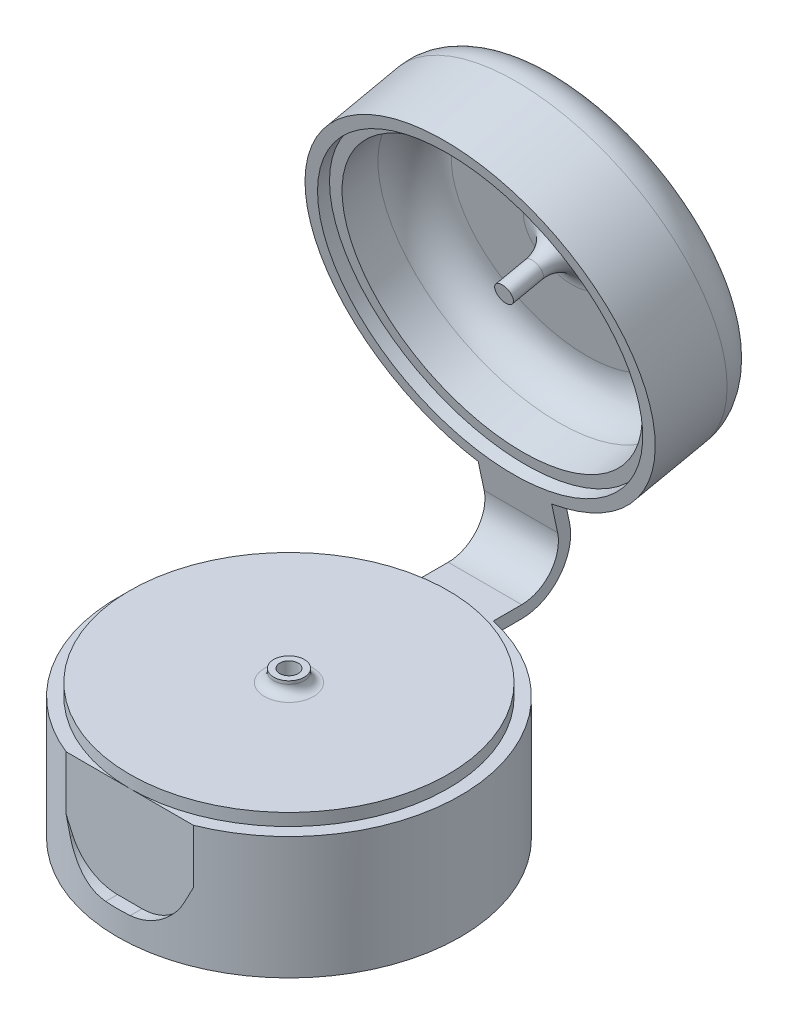
ISO-10303-21;
HEADER;
FILE_DESCRIPTION(('STEP AP214'),'2;1');
FILE_NAME('part.step','',(''),(''),'','','');
FILE_SCHEMA(('AUTOMOTIVE_DESIGN { 1 0 10303 214 1 1 1 1 }'));
ENDSEC;
DATA;
#1=APPLICATION_CONTEXT('core data for automotive mechanical design processes');
#2=APPLICATION_PROTOCOL_DEFINITION('international standard','automotive_design',2000,#1);
#3=PRODUCT_CONTEXT('',#1,'mechanical');
#4=PRODUCT('Part','Part','',(#3));
#5=PRODUCT_RELATED_PRODUCT_CATEGORY('part','',(#4));
#6=PRODUCT_DEFINITION_FORMATION('','',#4);
#7=PRODUCT_DEFINITION_CONTEXT('part definition',#1,'design');
#8=PRODUCT_DEFINITION('design','',#6,#7);
#9=PRODUCT_DEFINITION_SHAPE('','',#8);
#10=(LENGTH_UNIT() NAMED_UNIT(*) SI_UNIT(.MILLI.,.METRE.));
#11=(NAMED_UNIT(*) PLANE_ANGLE_UNIT() SI_UNIT($,.RADIAN.));
#12=(NAMED_UNIT(*) SI_UNIT($,.STERADIAN.) SOLID_ANGLE_UNIT());
#13=UNCERTAINTY_MEASURE_WITH_UNIT(LENGTH_MEASURE(1.E-05),#10,'distance_accuracy_value','');
#14=(GEOMETRIC_REPRESENTATION_CONTEXT(3) GLOBAL_UNCERTAINTY_ASSIGNED_CONTEXT((#13)) GLOBAL_UNIT_ASSIGNED_CONTEXT((#10,
#11,#12)) REPRESENTATION_CONTEXT('',''));
#15=CARTESIAN_POINT('',(0.,0.,0.));
#16=DIRECTION('',(0.,0.,1.));
#17=DIRECTION('',(1.,0.,0.));
#18=AXIS2_PLACEMENT_3D('',#15,#16,#17);
#19=CARTESIAN_POINT('',(3.,5.76608956547247,-19.2888553304819));
#20=DIRECTION('',(0.,-0.207911690817765,0.978147600733804));
#21=DIRECTION('',(0.,-0.978147600733805,-0.207911690817765));
#22=AXIS2_PLACEMENT_3D('',#19,#20,#21);
#23=PLANE('',#22);
#24=CARTESIAN_POINT('',(0.,18.4820083750119,-16.586003349851));
#25=DIRECTION('',(0.,-0.207911690817765,0.978147600733804));
#26=DIRECTION('',(0.,-0.978147600733805,-0.207911690817765));
#27=AXIS2_PLACEMENT_3D('',#24,#25,#26);
#28=CIRCLE('',#27,14.);
#29=CARTESIAN_POINT('',(3.,5.10604110944258,-19.4291529608313));
#30=VERTEX_POINT('',#29);
#31=CARTESIAN_POINT('',(-3.,5.10604110944258,-19.4291529608313));
#32=VERTEX_POINT('',#31);
#33=EDGE_CURVE('E57',#30,#32,#28,.F.);
#34=ORIENTED_EDGE('',*,*,#33,.F.);
#35=DIRECTION('',(0.,0.978147600733805,0.207911690817765));
#36=VECTOR('',#35,1.);
#37=CARTESIAN_POINT('',(3.,5.76608956547247,-19.2888553304819));
#38=LINE('',#37,#36);
#39=CARTESIAN_POINT('',(3.,2.83164676327106,-19.9125904029352));
#40=VERTEX_POINT('',#39);
#41=EDGE_CURVE('E176',#40,#30,#38,.T.);
#42=ORIENTED_EDGE('',*,*,#41,.F.);
#43=DIRECTION('',(-1.,0.,0.));
#44=VECTOR('',#43,1.);
#45=CARTESIAN_POINT('',(3.,2.83164676327106,-19.9125904029352));
#46=LINE('',#45,#44);
#47=CARTESIAN_POINT('',(-3.,2.83164676327106,-19.9125904029352));
#48=VERTEX_POINT('',#47);
#49=EDGE_CURVE('E195',#40,#48,#46,.T.);
#50=ORIENTED_EDGE('',*,*,#49,.T.);
#51=DIRECTION('',(0.,0.978147600733805,0.207911690817765));
#52=VECTOR('',#51,1.);
#53=CARTESIAN_POINT('',(-3.,5.76608956547247,-19.2888553304819));
#54=LINE('',#53,#52);
#55=EDGE_CURVE('E150',#48,#32,#54,.T.);
#56=ORIENTED_EDGE('',*,*,#55,.T.);
#57=EDGE_LOOP('',(#34,#42,#50,#56));
#58=FACE_BOUND('',#57,.T.);
#59=ADVANCED_FACE('F34',(#58),#23,.F.);
#60=CARTESIAN_POINT('',(3.,2.,-16.));
#61=DIRECTION('',(1.,0.,0.));
#62=DIRECTION('',(0.,0.,-1.));
#63=AXIS2_PLACEMENT_3D('',#60,#61,#62);
#64=PLANE('',#63);
#65=ORIENTED_EDGE('',*,*,#41,.T.);
#66=DIRECTION('',(0.,0.207911690817764,-0.978147600733805));
#67=VECTOR('',#66,1.);
#68=CARTESIAN_POINT('',(3.,6.76933463598469,-27.2543337667017));
#69=LINE('',#68,#67);
#70=CARTESIAN_POINT('',(3.,4.89812941862481,-18.4510053600974));
#71=VERTEX_POINT('',#70);
#72=EDGE_CURVE('E49',#30,#71,#69,.F.);
#73=ORIENTED_EDGE('',*,*,#72,.T.);
#74=DIRECTION('',(0.,-0.978147600733805,-0.207911690817762));
#75=VECTOR('',#74,1.);
#76=CARTESIAN_POINT('',(3.,2.62373507245329,-18.9344428022014));
#77=LINE('',#76,#75);
#78=CARTESIAN_POINT('',(3.,2.62373507245329,-18.9344428022014));
#79=VERTEX_POINT('',#78);
#80=EDGE_CURVE('E160',#71,#79,#77,.T.);
#81=ORIENTED_EDGE('',*,*,#80,.T.);
#82=CARTESIAN_POINT('',(3.,2.,-16.));
#83=DIRECTION('',(-1.,0.,0.));
#84=DIRECTION('',(0.,0.,-1.));
#85=AXIS2_PLACEMENT_3D('',#82,#83,#84);
#86=CIRCLE('',#85,3.);
#87=CARTESIAN_POINT('',(3.,-0.999999999999997,-16.));
#88=VERTEX_POINT('',#87);
#89=EDGE_CURVE('E179',#79,#88,#86,.T.);
#90=ORIENTED_EDGE('',*,*,#89,.T.);
#91=DIRECTION('',(0.,0.,1.));
#92=VECTOR('',#91,1.);
#93=CARTESIAN_POINT('',(3.,-0.999999999999998,-13.));
#94=LINE('',#93,#92);
#95=CARTESIAN_POINT('',(3.,-0.999999999999998,-13.6747943311773));
#96=VERTEX_POINT('',#95);
#97=EDGE_CURVE('E181',#88,#96,#94,.T.);
#98=ORIENTED_EDGE('',*,*,#97,.T.);
#99=DIRECTION('',(0.,1.,0.));
#100=VECTOR('',#99,1.);
#101=CARTESIAN_POINT('',(3.,0.,-13.6747943311773));
#102=LINE('',#101,#100);
#103=CARTESIAN_POINT('',(3.,-2.,-13.6747943311773));
#104=VERTEX_POINT('',#103);
#105=EDGE_CURVE('E157',#96,#104,#102,.F.);
#106=ORIENTED_EDGE('',*,*,#105,.T.);
#107=DIRECTION('',(0.,0.,-1.));
#108=VECTOR('',#107,1.);
#109=CARTESIAN_POINT('',(3.,-2.,-16.));
#110=LINE('',#109,#108);
#111=CARTESIAN_POINT('',(3.,-2.,-16.));
#112=VERTEX_POINT('',#111);
#113=EDGE_CURVE('E171',#104,#112,#110,.T.);
#114=ORIENTED_EDGE('',*,*,#113,.T.);
#115=CARTESIAN_POINT('',(3.,2.,-16.));
#116=DIRECTION('',(1.,0.,0.));
#117=DIRECTION('',(0.,0.,1.));
#118=AXIS2_PLACEMENT_3D('',#115,#116,#117);
#119=CIRCLE('',#118,4.);
#120=EDGE_CURVE('E173',#112,#40,#119,.T.);
#121=ORIENTED_EDGE('',*,*,#120,.T.);
#122=EDGE_LOOP('',(#65,#73,#81,#90,#98,#106,#114,#121));
#123=FACE_BOUND('',#122,.T.);
#124=ADVANCED_FACE('F342',(#123),#64,.T.);
#125=CARTESIAN_POINT('',(-3.,2.,-16.));
#126=DIRECTION('',(1.,0.,0.));
#127=DIRECTION('',(0.,0.,-1.));
#128=AXIS2_PLACEMENT_3D('',#125,#126,#127);
#129=PLANE('',#128);
#130=DIRECTION('',(0.,0.207911690817764,-0.978147600733805));
#131=VECTOR('',#130,1.);
#132=CARTESIAN_POINT('',(-3.,6.76933463598469,-27.2543337667017));
#133=LINE('',#132,#131);
#134=CARTESIAN_POINT('',(-3.,4.89812941862481,-18.4510053600974));
#135=VERTEX_POINT('',#134);
#136=EDGE_CURVE('E143',#32,#135,#133,.F.);
#137=ORIENTED_EDGE('',*,*,#136,.F.);
#138=ORIENTED_EDGE('',*,*,#55,.F.);
#139=CARTESIAN_POINT('',(-3.,2.,-16.));
#140=DIRECTION('',(1.,0.,0.));
#141=DIRECTION('',(0.,0.,1.));
#142=AXIS2_PLACEMENT_3D('',#139,#140,#141);
#143=CIRCLE('',#142,4.);
#144=CARTESIAN_POINT('',(-3.,-2.,-16.));
#145=VERTEX_POINT('',#144);
#146=EDGE_CURVE('E185',#145,#48,#143,.T.);
#147=ORIENTED_EDGE('',*,*,#146,.F.);
#148=DIRECTION('',(0.,0.,-1.));
#149=VECTOR('',#148,1.);
#150=CARTESIAN_POINT('',(-3.,-2.,-16.));
#151=LINE('',#150,#149);
#152=CARTESIAN_POINT('',(-3.,-2.,-13.6747943311773));
#153=VERTEX_POINT('',#152);
#154=EDGE_CURVE('E170',#153,#145,#151,.T.);
#155=ORIENTED_EDGE('',*,*,#154,.F.);
#156=DIRECTION('',(0.,1.,0.));
#157=VECTOR('',#156,1.);
#158=CARTESIAN_POINT('',(-3.,0.,-13.6747943311773));
#159=LINE('',#158,#157);
#160=CARTESIAN_POINT('',(-3.,-0.999999999999998,-13.6747943311773));
#161=VERTEX_POINT('',#160);
#162=EDGE_CURVE('E304',#161,#153,#159,.F.);
#163=ORIENTED_EDGE('',*,*,#162,.F.);
#164=DIRECTION('',(0.,0.,1.));
#165=VECTOR('',#164,1.);
#166=CARTESIAN_POINT('',(-3.,-0.999999999999998,-13.));
#167=LINE('',#166,#165);
#168=CARTESIAN_POINT('',(-3.,-0.999999999999997,-16.));
#169=VERTEX_POINT('',#168);
#170=EDGE_CURVE('E174',#169,#161,#167,.T.);
#171=ORIENTED_EDGE('',*,*,#170,.F.);
#172=CARTESIAN_POINT('',(-3.,2.,-16.));
#173=DIRECTION('',(-1.,0.,0.));
#174=DIRECTION('',(0.,0.,-1.));
#175=AXIS2_PLACEMENT_3D('',#172,#173,#174);
#176=CIRCLE('',#175,3.);
#177=CARTESIAN_POINT('',(-3.,2.62373507245329,-18.9344428022014));
#178=VERTEX_POINT('',#177);
#179=EDGE_CURVE('E145',#178,#169,#176,.T.);
#180=ORIENTED_EDGE('',*,*,#179,.F.);
#181=DIRECTION('',(0.,-0.978147600733805,-0.207911690817762));
#182=VECTOR('',#181,1.);
#183=CARTESIAN_POINT('',(-3.,2.62373507245329,-18.9344428022014));
#184=LINE('',#183,#182);
#185=EDGE_CURVE('E139',#135,#178,#184,.T.);
#186=ORIENTED_EDGE('',*,*,#185,.F.);
#187=EDGE_LOOP('',(#137,#138,#147,#155,#163,#171,#180,#186));
#188=FACE_BOUND('',#187,.T.);
#189=ADVANCED_FACE('F141',(#188),#129,.F.);
#190=CARTESIAN_POINT('',(0.,-1.,13.));
#191=DIRECTION('',(0.,1.,0.));
#192=DIRECTION('',(0.,0.,1.));
#193=AXIS2_PLACEMENT_3D('',#190,#191,#192);
#194=PLANE('',#193);
#195=DIRECTION('',(1.,0.,0.));
#196=VECTOR('',#195,1.);
#197=CARTESIAN_POINT('',(-400000.,-1.0000000000332,13.));
#198=LINE('',#197,#196);
#199=CARTESIAN_POINT('',(-5.19615242270663,-1.,13.));
#200=VERTEX_POINT('',#199);
#201=CARTESIAN_POINT('',(0.,-0.999999999984737,13.));
#202=VERTEX_POINT('',#201);
#203=EDGE_CURVE('E210',#200,#202,#198,.T.);
#204=ORIENTED_EDGE('',*,*,#203,.T.);
#205=CARTESIAN_POINT('',(0.,-1.,0.));
#206=DIRECTION('',(0.,1.,0.));
#207=DIRECTION('',(0.,0.,1.));
#208=AXIS2_PLACEMENT_3D('',#205,#206,#207);
#209=CIRCLE('',#208,13.);
#210=EDGE_CURVE('E241',#202,#202,#209,.T.);
#211=ORIENTED_EDGE('',*,*,#210,.F.);
#212=CARTESIAN_POINT('',(5.19615242268401,-0.999999999984736,13.));
#213=VERTEX_POINT('',#212);
#214=EDGE_CURVE('E207',#202,#213,#198,.T.);
#215=ORIENTED_EDGE('',*,*,#214,.T.);
#216=CARTESIAN_POINT('',(0.,-1.,0.));
#217=DIRECTION('',(0.,1.,0.));
#218=DIRECTION('',(0.,0.,1.));
#219=AXIS2_PLACEMENT_3D('',#216,#217,#218);
#220=CIRCLE('',#219,14.);
#221=EDGE_CURVE('E238',#213,#96,#220,.T.);
#222=ORIENTED_EDGE('',*,*,#221,.T.);
#223=ORIENTED_EDGE('',*,*,#97,.F.);
#224=DIRECTION('',(-1.,0.,0.));
#225=VECTOR('',#224,1.);
#226=CARTESIAN_POINT('',(3.,-0.999999999999997,-16.));
#227=LINE('',#226,#225);
#228=EDGE_CURVE('E183',#88,#169,#227,.T.);
#229=ORIENTED_EDGE('',*,*,#228,.T.);
#230=ORIENTED_EDGE('',*,*,#170,.T.);
#231=EDGE_CURVE('E237',#161,#200,#220,.T.);
#232=ORIENTED_EDGE('',*,*,#231,.T.);
#233=EDGE_LOOP('',(#204,#211,#215,#222,#223,#229,#230,#232));
#234=FACE_BOUND('',#233,.T.);
#235=ADVANCED_FACE('F372',(#234),#194,.T.);
#236=CARTESIAN_POINT('',(0.,0.,0.));
#237=DIRECTION('',(0.,1.,0.));
#238=DIRECTION('',(0.,0.,1.));
#239=AXIS2_PLACEMENT_3D('',#236,#237,#238);
#240=CYLINDRICAL_SURFACE('',#239,14.);
#241=ORIENTED_EDGE('',*,*,#105,.F.);
#242=ORIENTED_EDGE('',*,*,#221,.F.);
#243=DIRECTION('',(0.,1.,0.));
#244=VECTOR('',#243,1.);
#245=CARTESIAN_POINT('',(5.19615242270663,0.,13.));
#246=LINE('',#245,#244);
#247=CARTESIAN_POINT('',(5.19615242269532,-5.40966069200977,13.));
#248=VERTEX_POINT('',#247);
#249=EDGE_CURVE('E301',#213,#248,#246,.F.);
#250=ORIENTED_EDGE('',*,*,#249,.T.);
#251=CARTESIAN_POINT('',(0.,-17.0804101162155,0.));
#252=DIRECTION('',(0.913545457642601,-0.406736643075801,0.));
#253=DIRECTION('',(0.406736643075801,0.913545457642601,0.));
#254=AXIS2_PLACEMENT_3D('',#251,#252,#253);
#255=ELLIPSE('',#254,34.4203066980393,14.);
#256=CARTESIAN_POINT('',(4.65418183054567,-6.62694657233942,13.2037339979304));
#257=VERTEX_POINT('',#256);
#258=EDGE_CURVE('E299',#257,#248,#255,.F.);
#259=ORIENTED_EDGE('',*,*,#258,.F.);
#260=CARTESIAN_POINT('',(4.65418183055285,-6.62694657234262,13.2037339979322));
#261=CARTESIAN_POINT('',(4.60770238418185,-6.7313619093991,13.2201138934832));
#262=CARTESIAN_POINT('',(4.55681597144195,-6.833590991852,13.2377787151335));
#263=CARTESIAN_POINT('',(4.44670496079629,-7.03302181049813,13.2751730409014));
#264=CARTESIAN_POINT('',(4.38748282392291,-7.13022501898598,13.294901935184));
#265=CARTESIAN_POINT('',(4.26122134402236,-7.31890218761944,13.3359057177815));
#266=CARTESIAN_POINT('',(4.19419113444681,-7.41038265307334,13.3571787890368));
#267=CARTESIAN_POINT('',(4.05276769919623,-7.587167279863,13.4007671336001));
#268=CARTESIAN_POINT('',(3.97837401713235,-7.67247105779886,13.4230824714624));
#269=CARTESIAN_POINT('',(3.74500220610196,-7.91820154318046,13.4907789379223));
#270=CARTESIAN_POINT('',(3.57563166706784,-8.06874754718293,13.5369782758331));
#271=CARTESIAN_POINT('',(3.21349562823947,-8.33939256875918,13.6274792095998));
#272=CARTESIAN_POINT('',(3.02071922519357,-8.45947731535107,13.6717799079032));
#273=CARTESIAN_POINT('',(2.71650829026302,-8.61480948752682,13.7343213132395));
#274=CARTESIAN_POINT('',(2.61179345494503,-8.66270537698681,13.7546476813755));
#275=CARTESIAN_POINT('',(2.39834424750639,-8.74938414123713,13.793465143738));
#276=CARTESIAN_POINT('',(2.28961145764585,-8.78817055997161,13.811956950059));
#277=CARTESIAN_POINT('',(2.06902472558075,-8.8562283943567,13.8467178320414));
#278=CARTESIAN_POINT('',(1.95717495918947,-8.88551193283837,13.8629897241587));
#279=CARTESIAN_POINT('',(1.7310842056246,-8.93432061021547,13.8930320430789));
#280=CARTESIAN_POINT('',(1.61684450360951,-8.95385086008524,13.9068037776155));
#281=CARTESIAN_POINT('',(1.41871433744609,-8.97890706494858,13.9281815681392));
#282=CARTESIAN_POINT('',(1.33518724886112,-8.98681411878162,13.9364386203397));
#283=CARTESIAN_POINT('',(1.16779500967784,-8.99735827701315,13.9514634117744));
#284=CARTESIAN_POINT('',(1.08393055418494,-9.00000326922625,13.9582333665898));
#285=CARTESIAN_POINT('',(0.999999999976357,-9.00000000000002,13.9642400437706));
#286=B_SPLINE_CURVE_WITH_KNOTS('',3,(#260,#261,#262,#263,#264,#265,#266,#267,#268,#269,#270,
#271,#272,#273,#274,#275,#276,#277,#278,#279,#280,#281,#282,#283,#284,#285),.UNSPECIFIED.,.F.,
.F.,(4,2,2,2,2,2,2,2,2,2,2,2,4),(0.,0.346239928732679,0.692377847459899,1.03811486397337,
1.38387332274116,2.07430031878475,2.7650501822866,3.11546930243334,3.46575186903376,
3.81558580703223,4.16523623017036,4.41798450768595,4.67035362996135),.UNSPECIFIED.);
#287=CARTESIAN_POINT('',(0.999999999976353,-9.00000000001455,13.9642400437706));
#288=VERTEX_POINT('',#287);
#289=EDGE_CURVE('E292',#257,#288,#286,.T.);
#290=ORIENTED_EDGE('',*,*,#289,.T.);
#291=CARTESIAN_POINT('',(0.,-9.00000000001455,0.));
#292=DIRECTION('',(0.,-1.,0.));
#293=DIRECTION('',(0.,0.,-1.));
#294=AXIS2_PLACEMENT_3D('',#291,#292,#293);
#295=CIRCLE('',#294,14.);
#296=CARTESIAN_POINT('',(-0.999999999976353,-9.00000000001455,13.9642400437706));
#297=VERTEX_POINT('',#296);
#298=EDGE_CURVE('E263',#297,#288,#295,.F.);
#299=ORIENTED_EDGE('',*,*,#298,.F.);
#300=CARTESIAN_POINT('',(-0.999999999976352,-9.,13.9642400437706));
#301=CARTESIAN_POINT('',(-1.11170381352312,-9.00001300917234,13.9562535832862));
#302=CARTESIAN_POINT('',(-1.22329760770433,-8.9953211896307,13.9469025003262));
#303=CARTESIAN_POINT('',(-1.44543314974419,-8.97667976305009,13.9256265595796));
#304=CARTESIAN_POINT('',(-1.55597516969575,-8.96273262026274,13.9137023874542));
#305=CARTESIAN_POINT('',(-1.77493536354901,-8.92578290736994,13.8874672823605));
#306=CARTESIAN_POINT('',(-1.88335852298495,-8.90280523039725,13.8731629723427));
#307=CARTESIAN_POINT('',(-2.09761727099696,-8.84804858740446,13.8423891911962));
#308=CARTESIAN_POINT('',(-2.20345275700573,-8.81626927312837,13.8259196344084));
#309=CARTESIAN_POINT('',(-2.51587009227694,-8.70817712978223,13.7736984925607));
#310=CARTESIAN_POINT('',(-2.71770573498065,-8.61905141630281,13.73509224909));
#311=CARTESIAN_POINT('',(-3.10336665158273,-8.40941968513442,13.6531372777038));
#312=CARTESIAN_POINT('',(-3.28717521270107,-8.2888849198616,13.6097842263915));
#313=CARTESIAN_POINT('',(-3.63798023261375,-8.01531151367578,13.5203144518856));
#314=CARTESIAN_POINT('',(-3.80425216755308,-7.86135763765756,13.4741536842232));
#315=CARTESIAN_POINT('',(-4.10862948226018,-7.52731853508458,13.3844818730886));
#316=CARTESIAN_POINT('',(-4.2467744255945,-7.34727063178329,13.3409671689696));
#317=CARTESIAN_POINT('',(-4.42291194826178,-7.07213557070306,13.2831130875388));
#318=CARTESIAN_POINT('',(-4.47379733277128,-6.98565533022998,13.266035199087));
#319=CARTESIAN_POINT('',(-4.56897014267501,-6.80900227617264,13.2335564300422));
#320=CARTESIAN_POINT('',(-4.61326698605376,-6.71883497293032,13.2181531643089));
#321=CARTESIAN_POINT('',(-4.65418183057455,-6.62694657229388,13.2037339979246));
#322=B_SPLINE_CURVE_WITH_KNOTS('',3,(#300,#301,#302,#303,#304,#305,#306,#307,#308,#309,#310,
#311,#312,#313,#314,#315,#316,#317,#318,#319,#320,#321),.UNSPECIFIED.,.F.,.F.,(4,2,2,2,2,2,2,2,
2,2,4),(0.,0.335840470959337,0.671591559460052,1.00642355208198,1.34126879495543,
2.00992105703035,2.67918747545106,3.36983097823269,4.05949620291679,4.36459851204121,
4.66926041260241),.UNSPECIFIED.);
#323=CARTESIAN_POINT('',(-4.65418183057455,-6.62694657229388,13.2037339979246));
#324=VERTEX_POINT('',#323);
#325=EDGE_CURVE('E254',#297,#324,#322,.T.);
#326=ORIENTED_EDGE('',*,*,#325,.T.);
#327=CARTESIAN_POINT('',(0.,-17.0804101160408,0.));
#328=DIRECTION('',(-0.913545457642601,-0.406736643075801,0.));
#329=DIRECTION('',(-0.406736643075801,0.913545457642601,0.));
#330=AXIS2_PLACEMENT_3D('',#327,#328,#329);
#331=ELLIPSE('',#330,34.4203066980393,14.);
#332=CARTESIAN_POINT('',(-5.19615242270953,-5.40966069182502,13.));
#333=VERTEX_POINT('',#332);
#334=EDGE_CURVE('E252',#333,#324,#331,.F.);
#335=ORIENTED_EDGE('',*,*,#334,.F.);
#336=DIRECTION('',(0.,1.,0.));
#337=VECTOR('',#336,1.);
#338=CARTESIAN_POINT('',(-5.19615242270663,0.,13.));
#339=LINE('',#338,#337);
#340=EDGE_CURVE('E249',#333,#200,#339,.T.);
#341=ORIENTED_EDGE('',*,*,#340,.T.);
#342=ORIENTED_EDGE('',*,*,#231,.F.);
#343=ORIENTED_EDGE('',*,*,#162,.T.);
#344=CARTESIAN_POINT('',(0.,-2.,0.));
#345=DIRECTION('',(0.,1.,0.));
#346=DIRECTION('',(0.,0.,1.));
#347=AXIS2_PLACEMENT_3D('',#344,#345,#346);
#348=CIRCLE('',#347,14.);
#349=EDGE_CURVE('E307',#153,#104,#348,.F.);
#350=ORIENTED_EDGE('',*,*,#349,.T.);
#351=EDGE_LOOP('',(#241,#242,#250,#259,#290,#299,#326,#335,#341,#342,#343,#350));
#352=FACE_BOUND('',#351,.T.);
#353=CARTESIAN_POINT('',(0.,-11.,0.));
#354=DIRECTION('',(0.,1.,0.));
#355=DIRECTION('',(0.,0.,1.));
#356=AXIS2_PLACEMENT_3D('',#353,#354,#355);
#357=CIRCLE('',#356,14.);
#358=CARTESIAN_POINT('',(0.,-11.,14.));
#359=VERTEX_POINT('',#358);
#360=EDGE_CURVE('E234',#359,#359,#357,.T.);
#361=ORIENTED_EDGE('',*,*,#360,.T.);
#362=EDGE_LOOP('',(#361));
#363=FACE_BOUND('',#362,.T.);
#364=ADVANCED_FACE('F265',(#352,#363),#240,.T.);
#365=CARTESIAN_POINT('',(0.,0.,2.));
#366=DIRECTION('',(0.,1.,0.));
#367=DIRECTION('',(0.,0.,1.));
#368=AXIS2_PLACEMENT_3D('',#365,#366,#367);
#369=PLANE('',#368);
#370=CARTESIAN_POINT('',(0.,0.,0.));
#371=DIRECTION('',(0.,1.,0.));
#372=DIRECTION('',(0.,0.,1.));
#373=AXIS2_PLACEMENT_3D('',#370,#371,#372);
#374=CIRCLE('',#373,13.);
#375=CARTESIAN_POINT('',(0.,0.,13.));
#376=VERTEX_POINT('',#375);
#377=EDGE_CURVE('E243',#376,#376,#374,.T.);
#378=ORIENTED_EDGE('',*,*,#377,.T.);
#379=EDGE_LOOP('',(#378));
#380=FACE_BOUND('',#379,.T.);
#381=CARTESIAN_POINT('',(0.,0.,0.));
#382=DIRECTION('',(0.,1.,0.));
#383=DIRECTION('',(0.,0.,1.));
#384=AXIS2_PLACEMENT_3D('',#381,#382,#383);
#385=CIRCLE('',#384,2.);
#386=CARTESIAN_POINT('',(0.,0.,2.));
#387=VERTEX_POINT('',#386);
#388=EDGE_CURVE('E246',#387,#387,#385,.T.);
#389=ORIENTED_EDGE('',*,*,#388,.F.);
#390=EDGE_LOOP('',(#389));
#391=FACE_BOUND('',#390,.T.);
#392=ADVANCED_FACE('F406',(#380,#391),#369,.T.);
#393=CARTESIAN_POINT('',(0.,0.,0.));
#394=DIRECTION('',(0.,1.,0.));
#395=DIRECTION('',(0.,0.,1.));
#396=AXIS2_PLACEMENT_3D('',#393,#394,#395);
#397=CYLINDRICAL_SURFACE('',#396,13.);
#398=ORIENTED_EDGE('',*,*,#210,.T.);
#399=EDGE_LOOP('',(#398));
#400=FACE_BOUND('',#399,.T.);
#401=ORIENTED_EDGE('',*,*,#377,.F.);
#402=EDGE_LOOP('',(#401));
#403=FACE_BOUND('',#402,.T.);
#404=ADVANCED_FACE('F408',(#400,#403),#397,.T.);
#405=CARTESIAN_POINT('',(0.,-11.,14.));
#406=DIRECTION('',(0.,-1.,0.));
#407=DIRECTION('',(0.,0.,-1.));
#408=AXIS2_PLACEMENT_3D('',#405,#406,#407);
#409=PLANE('',#408);
#410=CARTESIAN_POINT('',(0.,-11.,0.));
#411=DIRECTION('',(0.,1.,0.));
#412=DIRECTION('',(0.,0.,1.));
#413=AXIS2_PLACEMENT_3D('',#410,#411,#412);
#414=CIRCLE('',#413,12.);
#415=CARTESIAN_POINT('',(0.,-11.,12.));
#416=VERTEX_POINT('',#415);
#417=EDGE_CURVE('E231',#416,#416,#414,.T.);
#418=ORIENTED_EDGE('',*,*,#417,.T.);
#419=EDGE_LOOP('',(#418));
#420=FACE_BOUND('',#419,.T.);
#421=ORIENTED_EDGE('',*,*,#360,.F.);
#422=EDGE_LOOP('',(#421));
#423=FACE_BOUND('',#422,.T.);
#424=ADVANCED_FACE('F411',(#420,#423),#409,.T.);
#425=CARTESIAN_POINT('',(0.,0.,0.));
#426=DIRECTION('',(0.,1.,0.));
#427=DIRECTION('',(0.,0.,1.));
#428=AXIS2_PLACEMENT_3D('',#425,#426,#427);
#429=CYLINDRICAL_SURFACE('',#428,12.);
#430=CARTESIAN_POINT('',(0.,-2.,0.));
#431=DIRECTION('',(0.,1.,0.));
#432=DIRECTION('',(0.,0.,1.));
#433=AXIS2_PLACEMENT_3D('',#430,#431,#432);
#434=CIRCLE('',#433,12.);
#435=CARTESIAN_POINT('',(0.,-2.,12.));
#436=VERTEX_POINT('',#435);
#437=EDGE_CURVE('E228',#436,#436,#434,.T.);
#438=ORIENTED_EDGE('',*,*,#437,.T.);
#439=EDGE_LOOP('',(#438));
#440=FACE_BOUND('',#439,.T.);
#441=ORIENTED_EDGE('',*,*,#417,.F.);
#442=EDGE_LOOP('',(#441));
#443=FACE_BOUND('',#442,.T.);
#444=ADVANCED_FACE('F515',(#440,#443),#429,.F.);
#445=CARTESIAN_POINT('',(0.,-2.,12.));
#446=DIRECTION('',(0.,-1.,0.));
#447=DIRECTION('',(0.,0.,-1.));
#448=AXIS2_PLACEMENT_3D('',#445,#446,#447);
#449=PLANE('',#448);
#450=CARTESIAN_POINT('',(0.,-2.,0.));
#451=DIRECTION('',(0.,-1.,0.));
#452=DIRECTION('',(0.,0.,-1.));
#453=AXIS2_PLACEMENT_3D('',#450,#451,#452);
#454=CIRCLE('',#453,2.);
#455=CARTESIAN_POINT('',(0.,-2.,-2.));
#456=VERTEX_POINT('',#455);
#457=EDGE_CURVE('E486',#456,#456,#454,.T.);
#458=ORIENTED_EDGE('',*,*,#457,.F.);
#459=EDGE_LOOP('',(#458));
#460=FACE_BOUND('',#459,.T.);
#461=ORIENTED_EDGE('',*,*,#437,.F.);
#462=EDGE_LOOP('',(#461));
#463=FACE_BOUND('',#462,.T.);
#464=ADVANCED_FACE('F289',(#460,#463),#449,.T.);
#465=CARTESIAN_POINT('',(1.,-5.,21.5));
#466=DIRECTION('',(0.,0.,-1.));
#467=DIRECTION('',(-1.,0.,0.));
#468=AXIS2_PLACEMENT_3D('',#465,#466,#467);
#469=CYLINDRICAL_SURFACE('',#468,4.);
#470=DIRECTION('',(0.,0.,-1.));
#471=VECTOR('',#470,1.);
#472=CARTESIAN_POINT('',(4.65418183054567,-6.62694657233942,21.5));
#473=LINE('',#472,#471);
#474=CARTESIAN_POINT('',(4.65418183054567,-6.62694657233942,13.));
#475=VERTEX_POINT('',#474);
#476=EDGE_CURVE('E226',#257,#475,#473,.T.);
#477=ORIENTED_EDGE('',*,*,#476,.T.);
#478=CARTESIAN_POINT('',(1.,-5.,13.));
#479=DIRECTION('',(0.,0.,1.));
#480=DIRECTION('',(1.,0.,0.));
#481=AXIS2_PLACEMENT_3D('',#478,#479,#480);
#482=CIRCLE('',#481,4.);
#483=CARTESIAN_POINT('',(0.999999999976353,-9.00000000001455,13.));
#484=VERTEX_POINT('',#483);
#485=EDGE_CURVE('E201',#484,#475,#482,.T.);
#486=ORIENTED_EDGE('',*,*,#485,.F.);
#487=DIRECTION('',(0.,0.,-1.));
#488=VECTOR('',#487,1.);
#489=CARTESIAN_POINT('',(0.999999999976353,-9.00000000001455,21.5));
#490=LINE('',#489,#488);
#491=EDGE_CURVE('E220',#288,#484,#490,.T.);
#492=ORIENTED_EDGE('',*,*,#491,.F.);
#493=ORIENTED_EDGE('',*,*,#289,.F.);
#494=EDGE_LOOP('',(#477,#486,#492,#493));
#495=FACE_BOUND('',#494,.T.);
#496=ADVANCED_FACE('F284',(#495),#469,.F.);
#497=CARTESIAN_POINT('',(-174518.029095015,-391990.991466804,21.5));
#498=DIRECTION('',(0.913545457642601,-0.406736643075801,0.));
#499=DIRECTION('',(0.406736643075801,0.913545457642601,0.));
#500=AXIS2_PLACEMENT_3D('',#497,#498,#499);
#501=PLANE('',#500);
#502=ORIENTED_EDGE('',*,*,#258,.T.);
#503=DIRECTION('',(-0.406736643075801,-0.913545457642601,0.));
#504=VECTOR('',#503,1.);
#505=CARTESIAN_POINT('',(-174518.029095015,-391990.991466804,13.));
#506=LINE('',#505,#504);
#507=EDGE_CURVE('E204',#248,#475,#506,.T.);
#508=ORIENTED_EDGE('',*,*,#507,.T.);
#509=ORIENTED_EDGE('',*,*,#476,.F.);
#510=EDGE_LOOP('',(#502,#508,#509));
#511=FACE_BOUND('',#510,.T.);
#512=ADVANCED_FACE('F280',(#511),#501,.F.);
#513=CARTESIAN_POINT('',(42170.2716385576,-94733.0612758462,21.5));
#514=DIRECTION('',(-0.913545457642601,-0.406736643075801,0.));
#515=DIRECTION('',(0.406736643075801,-0.913545457642601,0.));
#516=AXIS2_PLACEMENT_3D('',#513,#514,#515);
#517=PLANE('',#516);
#518=ORIENTED_EDGE('',*,*,#334,.T.);
#519=DIRECTION('',(0.,0.,-1.));
#520=VECTOR('',#519,1.);
#521=CARTESIAN_POINT('',(-4.65418183057455,-6.62694657229388,21.5));
#522=LINE('',#521,#520);
#523=CARTESIAN_POINT('',(-4.65418183057455,-6.62694657229388,13.));
#524=VERTEX_POINT('',#523);
#525=EDGE_CURVE('E224',#324,#524,#522,.T.);
#526=ORIENTED_EDGE('',*,*,#525,.T.);
#527=DIRECTION('',(-0.406736643075801,0.913545457642601,0.));
#528=VECTOR('',#527,1.);
#529=CARTESIAN_POINT('',(42170.2716385576,-94733.0612758462,13.));
#530=LINE('',#529,#528);
#531=EDGE_CURVE('E211',#524,#333,#530,.T.);
#532=ORIENTED_EDGE('',*,*,#531,.T.);
#533=EDGE_LOOP('',(#518,#526,#532));
#534=FACE_BOUND('',#533,.T.);
#535=ADVANCED_FACE('F275',(#534),#517,.F.);
#536=CARTESIAN_POINT('',(-1.,-5.,21.5));
#537=DIRECTION('',(0.,0.,-1.));
#538=DIRECTION('',(-1.,0.,0.));
#539=AXIS2_PLACEMENT_3D('',#536,#537,#538);
#540=CYLINDRICAL_SURFACE('',#539,4.);
#541=DIRECTION('',(0.,0.,-1.));
#542=VECTOR('',#541,1.);
#543=CARTESIAN_POINT('',(-0.999999999976353,-9.00000000001455,21.5));
#544=LINE('',#543,#542);
#545=CARTESIAN_POINT('',(-0.999999999976353,-9.00000000001455,13.));
#546=VERTEX_POINT('',#545);
#547=EDGE_CURVE('E222',#297,#546,#544,.T.);
#548=ORIENTED_EDGE('',*,*,#547,.T.);
#549=CARTESIAN_POINT('',(-1.,-5.,13.));
#550=DIRECTION('',(0.,0.,1.));
#551=DIRECTION('',(1.,0.,0.));
#552=AXIS2_PLACEMENT_3D('',#549,#550,#551);
#553=CIRCLE('',#552,4.);
#554=EDGE_CURVE('E214',#524,#546,#553,.T.);
#555=ORIENTED_EDGE('',*,*,#554,.F.);
#556=ORIENTED_EDGE('',*,*,#525,.F.);
#557=ORIENTED_EDGE('',*,*,#325,.F.);
#558=EDGE_LOOP('',(#548,#555,#556,#557));
#559=FACE_BOUND('',#558,.T.);
#560=ADVANCED_FACE('F269',(#559),#540,.F.);
#561=CARTESIAN_POINT('',(-400000.,-9.00000000001455,21.5));
#562=DIRECTION('',(0.,-1.,0.));
#563=DIRECTION('',(0.,0.,-1.));
#564=AXIS2_PLACEMENT_3D('',#561,#562,#563);
#565=PLANE('',#564);
#566=ORIENTED_EDGE('',*,*,#298,.T.);
#567=ORIENTED_EDGE('',*,*,#491,.T.);
#568=DIRECTION('',(-1.,0.,0.));
#569=VECTOR('',#568,1.);
#570=CARTESIAN_POINT('',(-400000.,-9.00000000001455,13.));
#571=LINE('',#570,#569);
#572=EDGE_CURVE('E217',#484,#546,#571,.T.);
#573=ORIENTED_EDGE('',*,*,#572,.T.);
#574=ORIENTED_EDGE('',*,*,#547,.F.);
#575=EDGE_LOOP('',(#566,#567,#573,#574));
#576=FACE_BOUND('',#575,.T.);
#577=ADVANCED_FACE('F274',(#576),#565,.F.);
#578=CARTESIAN_POINT('',(1.,-5.,13.));
#579=DIRECTION('',(0.,0.,1.));
#580=DIRECTION('',(1.,0.,0.));
#581=AXIS2_PLACEMENT_3D('',#578,#579,#580);
#582=PLANE('',#581);
#583=ORIENTED_EDGE('',*,*,#214,.F.);
#584=ORIENTED_EDGE('',*,*,#203,.F.);
#585=ORIENTED_EDGE('',*,*,#340,.F.);
#586=ORIENTED_EDGE('',*,*,#531,.F.);
#587=ORIENTED_EDGE('',*,*,#554,.T.);
#588=ORIENTED_EDGE('',*,*,#572,.F.);
#589=ORIENTED_EDGE('',*,*,#485,.T.);
#590=ORIENTED_EDGE('',*,*,#507,.F.);
#591=ORIENTED_EDGE('',*,*,#249,.F.);
#592=EDGE_LOOP('',(#583,#584,#585,#586,#587,#588,#589,#590,#591));
#593=FACE_BOUND('',#592,.T.);
#594=ADVANCED_FACE('F357',(#593),#582,.T.);
#595=CARTESIAN_POINT('',(3.,-2.,-16.));
#596=DIRECTION('',(0.,1.,0.));
#597=DIRECTION('',(0.,0.,1.));
#598=AXIS2_PLACEMENT_3D('',#595,#596,#597);
#599=PLANE('',#598);
#600=ORIENTED_EDGE('',*,*,#349,.F.);
#601=ORIENTED_EDGE('',*,*,#154,.T.);
#602=DIRECTION('',(-1.,0.,0.));
#603=VECTOR('',#602,1.);
#604=CARTESIAN_POINT('',(3.,-2.,-16.));
#605=LINE('',#604,#603);
#606=EDGE_CURVE('E198',#112,#145,#605,.T.);
#607=ORIENTED_EDGE('',*,*,#606,.F.);
#608=ORIENTED_EDGE('',*,*,#113,.F.);
#609=EDGE_LOOP('',(#600,#601,#607,#608));
#610=FACE_BOUND('',#609,.T.);
#611=ADVANCED_FACE('F354',(#610),#599,.F.);
#612=CARTESIAN_POINT('',(3.,2.,-16.));
#613=DIRECTION('',(-1.,0.,0.));
#614=DIRECTION('',(0.,0.,1.));
#615=AXIS2_PLACEMENT_3D('',#612,#613,#614);
#616=CYLINDRICAL_SURFACE('',#615,4.);
#617=ORIENTED_EDGE('',*,*,#146,.T.);
#618=ORIENTED_EDGE('',*,*,#49,.F.);
#619=ORIENTED_EDGE('',*,*,#120,.F.);
#620=ORIENTED_EDGE('',*,*,#606,.T.);
#621=EDGE_LOOP('',(#617,#618,#619,#620));
#622=FACE_BOUND('',#621,.T.);
#623=ADVANCED_FACE('F351',(#622),#616,.T.);
#624=CARTESIAN_POINT('',(3.,2.62373507245329,-18.9344428022014));
#625=DIRECTION('',(0.,0.207911690817762,-0.978147600733805));
#626=DIRECTION('',(0.,0.978147600733805,0.207911690817762));
#627=AXIS2_PLACEMENT_3D('',#624,#625,#626);
#628=PLANE('',#627);
#629=CARTESIAN_POINT('',(0.,18.2740966841942,-15.6078557491172));
#630=DIRECTION('',(0.,0.207911690817764,-0.978147600733805));
#631=DIRECTION('',(0.,0.978147600733805,0.207911690817764));
#632=AXIS2_PLACEMENT_3D('',#629,#630,#631);
#633=CIRCLE('',#632,13.);
#634=CARTESIAN_POINT('',(0.,30.9900154937336,-12.9050037684863));
#635=VERTEX_POINT('',#634);
#636=EDGE_CURVE('E495',#635,#635,#633,.T.);
#637=ORIENTED_EDGE('',*,*,#636,.T.);
#638=EDGE_LOOP('',(#637));
#639=FACE_BOUND('',#638,.T.);
#640=CARTESIAN_POINT('',(0.,18.2740966841942,-15.6078557491172));
#641=DIRECTION('',(0.,0.207911690817764,-0.978147600733805));
#642=DIRECTION('',(0.,0.978147600733805,0.207911690817764));
#643=AXIS2_PLACEMENT_3D('',#640,#641,#642);
#644=CIRCLE('',#643,14.);
#645=EDGE_CURVE('E155',#135,#71,#644,.T.);
#646=ORIENTED_EDGE('',*,*,#645,.F.);
#647=ORIENTED_EDGE('',*,*,#185,.T.);
#648=DIRECTION('',(-1.,0.,0.));
#649=VECTOR('',#648,1.);
#650=CARTESIAN_POINT('',(3.,2.62373507245329,-18.9344428022014));
#651=LINE('',#650,#649);
#652=EDGE_CURVE('E193',#79,#178,#651,.T.);
#653=ORIENTED_EDGE('',*,*,#652,.F.);
#654=ORIENTED_EDGE('',*,*,#80,.F.);
#655=EDGE_LOOP('',(#646,#647,#653,#654));
#656=FACE_BOUND('',#655,.T.);
#657=ADVANCED_FACE('F159',(#639,#656),#628,.F.);
#658=CARTESIAN_POINT('',(3.,2.,-16.));
#659=DIRECTION('',(-1.,0.,0.));
#660=DIRECTION('',(0.,0.,1.));
#661=AXIS2_PLACEMENT_3D('',#658,#659,#660);
#662=CYLINDRICAL_SURFACE('',#661,3.);
#663=ORIENTED_EDGE('',*,*,#179,.T.);
#664=ORIENTED_EDGE('',*,*,#228,.F.);
#665=ORIENTED_EDGE('',*,*,#89,.F.);
#666=ORIENTED_EDGE('',*,*,#652,.T.);
#667=EDGE_LOOP('',(#663,#664,#665,#666));
#668=FACE_BOUND('',#667,.T.);
#669=ADVANCED_FACE('F339',(#668),#662,.F.);
#670=CARTESIAN_POINT('',(0.,20.145301901554,-24.4111841557214));
#671=DIRECTION('',(0.,0.207911690817764,-0.978147600733805));
#672=DIRECTION('',(0.,0.978147600733805,0.207911690817764));
#673=AXIS2_PLACEMENT_3D('',#670,#671,#672);
#674=CYLINDRICAL_SURFACE('',#673,14.);
#675=CARTESIAN_POINT('',(0.,19.5215668291008,-21.47674135352));
#676=DIRECTION('',(0.,-0.207911690817764,0.978147600733805));
#677=DIRECTION('',(0.,-0.978147600733805,-0.207911690817764));
#678=AXIS2_PLACEMENT_3D('',#675,#676,#677);
#679=CIRCLE('',#678,14.);
#680=CARTESIAN_POINT('',(0.,5.82750041882748,-24.3875050249687));
#681=VERTEX_POINT('',#680);
#682=EDGE_CURVE('E42',#681,#681,#679,.T.);
#683=ORIENTED_EDGE('',*,*,#682,.T.);
#684=EDGE_LOOP('',(#683));
#685=FACE_BOUND('',#684,.T.);
#686=ORIENTED_EDGE('',*,*,#72,.F.);
#687=ORIENTED_EDGE('',*,*,#33,.T.);
#688=ORIENTED_EDGE('',*,*,#136,.T.);
#689=ORIENTED_EDGE('',*,*,#645,.T.);
#690=EDGE_LOOP('',(#686,#687,#688,#689));
#691=FACE_BOUND('',#690,.T.);
#692=ADVANCED_FACE('F154',(#685,#691),#674,.T.);
#693=CARTESIAN_POINT('',(0.,6.45123549128078,-27.3219478271701));
#694=DIRECTION('',(0.,-0.207911690817764,0.978147600733805));
#695=DIRECTION('',(0.,-0.978147600733805,-0.207911690817764));
#696=AXIS2_PLACEMENT_3D('',#693,#694,#695);
#697=PLANE('',#696);
#698=CARTESIAN_POINT('',(0.,20.145301901554,-24.4111841557214));
#699=DIRECTION('',(0.,-0.207911690817764,0.978147600733805));
#700=DIRECTION('',(0.,-0.978147600733805,-0.207911690817764));
#701=AXIS2_PLACEMENT_3D('',#698,#699,#700);
#702=CIRCLE('',#701,11.);
#703=CARTESIAN_POINT('',(0.,9.38567829348219,-26.6982127547168));
#704=VERTEX_POINT('',#703);
#705=EDGE_CURVE('E316',#704,#704,#702,.F.);
#706=ORIENTED_EDGE('',*,*,#705,.T.);
#707=EDGE_LOOP('',(#706));
#708=FACE_BOUND('',#707,.T.);
#709=ADVANCED_FACE('F328',(#708),#697,.F.);
#710=CARTESIAN_POINT('',(0.,19.7294785199185,-22.4548889542538));
#711=DIRECTION('',(0.,0.207911690817764,-0.978147600733805));
#712=DIRECTION('',(0.,0.978147600733805,0.207911690817764));
#713=AXIS2_PLACEMENT_3D('',#710,#711,#712);
#714=PLANE('',#713);
#715=CARTESIAN_POINT('',(0.,19.7294785199185,-22.4548889542538));
#716=DIRECTION('',(0.,0.207911690817764,-0.978147600733805));
#717=DIRECTION('',(0.,0.978147600733805,0.207911690817764));
#718=AXIS2_PLACEMENT_3D('',#715,#716,#717);
#719=CIRCLE('',#718,3.25);
#720=CARTESIAN_POINT('',(0.,22.9084582223034,-21.7791759590961));
#721=VERTEX_POINT('',#720);
#722=EDGE_CURVE('E11',#721,#721,#719,.F.);
#723=ORIENTED_EDGE('',*,*,#722,.F.);
#724=EDGE_LOOP('',(#723));
#725=FACE_BOUND('',#724,.T.);
#726=CARTESIAN_POINT('',(0.,19.7294785199185,-22.4548889542538));
#727=DIRECTION('',(0.,0.207911690817764,-0.978147600733805));
#728=DIRECTION('',(0.,0.978147600733805,0.207911690817764));
#729=AXIS2_PLACEMENT_3D('',#726,#727,#728);
#730=CIRCLE('',#729,9.00000000000001);
#731=CARTESIAN_POINT('',(0.,28.5328069265228,-20.5836837368939));
#732=VERTEX_POINT('',#731);
#733=EDGE_CURVE('E313',#732,#732,#730,.F.);
#734=ORIENTED_EDGE('',*,*,#733,.T.);
#735=EDGE_LOOP('',(#734));
#736=FACE_BOUND('',#735,.T.);
#737=ADVANCED_FACE('F330',(#725,#736),#714,.F.);
#738=CARTESIAN_POINT('',(0.,20.145301901554,-24.4111841557214));
#739=DIRECTION('',(0.,0.207911690817764,-0.978147600733805));
#740=DIRECTION('',(0.,0.978147600733805,0.207911690817764));
#741=AXIS2_PLACEMENT_3D('',#738,#739,#740);
#742=CYLINDRICAL_SURFACE('',#741,12.);
#743=CARTESIAN_POINT('',(0.,19.1057434474652,-19.5204461520524));
#744=DIRECTION('',(0.,0.207911690817764,-0.978147600733805));
#745=DIRECTION('',(0.,0.978147600733805,0.207911690817764));
#746=AXIS2_PLACEMENT_3D('',#743,#744,#745);
#747=CIRCLE('',#746,12.);
#748=CARTESIAN_POINT('',(0.,30.8435146562709,-17.0255058622392));
#749=VERTEX_POINT('',#748);
#750=EDGE_CURVE('E156',#749,#749,#747,.T.);
#751=ORIENTED_EDGE('',*,*,#750,.T.);
#752=EDGE_LOOP('',(#751));
#753=FACE_BOUND('',#752,.T.);
#754=CARTESIAN_POINT('',(0.,18.4820083750119,-16.586003349851));
#755=DIRECTION('',(0.,0.207911690817764,-0.978147600733805));
#756=DIRECTION('',(0.,0.978147600733805,0.207911690817764));
#757=AXIS2_PLACEMENT_3D('',#754,#755,#756);
#758=CIRCLE('',#757,12.);
#759=CARTESIAN_POINT('',(0.,30.2197795838176,-14.0910630600378));
#760=VERTEX_POINT('',#759);
#761=EDGE_CURVE('E161',#760,#760,#758,.T.);
#762=ORIENTED_EDGE('',*,*,#761,.F.);
#763=EDGE_LOOP('',(#762));
#764=FACE_BOUND('',#763,.T.);
#765=ADVANCED_FACE('F336',(#753,#764),#742,.F.);
#766=CARTESIAN_POINT('',(0.,6.74423716620627,-19.0809436396642));
#767=DIRECTION('',(0.,0.207911690817764,-0.978147600733805));
#768=DIRECTION('',(0.,0.978147600733805,0.207911690817764));
#769=AXIS2_PLACEMENT_3D('',#766,#767,#768);
#770=PLANE('',#769);
#771=CARTESIAN_POINT('',(0.,18.4820083750119,-16.586003349851));
#772=DIRECTION('',(0.,0.207911690817764,-0.978147600733805));
#773=DIRECTION('',(0.,0.978147600733805,0.207911690817764));
#774=AXIS2_PLACEMENT_3D('',#771,#772,#773);
#775=CIRCLE('',#774,13.);
#776=CARTESIAN_POINT('',(0.,31.1979271845514,-13.8831513692201));
#777=VERTEX_POINT('',#776);
#778=EDGE_CURVE('E165',#777,#777,#775,.T.);
#779=ORIENTED_EDGE('',*,*,#778,.F.);
#780=EDGE_LOOP('',(#779));
#781=FACE_BOUND('',#780,.T.);
#782=ORIENTED_EDGE('',*,*,#761,.T.);
#783=EDGE_LOOP('',(#782));
#784=FACE_BOUND('',#783,.T.);
#785=ADVANCED_FACE('F421',(#781,#784),#770,.F.);
#786=CARTESIAN_POINT('',(0.,20.145301901554,-24.4111841557214));
#787=DIRECTION('',(0.,0.207911690817764,-0.978147600733805));
#788=DIRECTION('',(0.,0.978147600733805,0.207911690817764));
#789=AXIS2_PLACEMENT_3D('',#786,#787,#788);
#790=CYLINDRICAL_SURFACE('',#789,13.);
#791=ORIENTED_EDGE('',*,*,#778,.T.);
#792=EDGE_LOOP('',(#791));
#793=FACE_BOUND('',#792,.T.);
#794=ORIENTED_EDGE('',*,*,#636,.F.);
#795=EDGE_LOOP('',(#794));
#796=FACE_BOUND('',#795,.T.);
#797=ADVANCED_FACE('F416',(#793,#796),#790,.F.);
#798=CARTESIAN_POINT('',(0.,19.1057434474652,-19.5204461520524));
#799=DIRECTION('',(0.,0.207911690817764,-0.978147600733805));
#800=DIRECTION('',(0.,0.978147600733805,0.207911690817764));
#801=AXIS2_PLACEMENT_3D('',#798,#799,#800);
#802=TOROIDAL_SURFACE('',#801,9.00000000000001,3.);
#803=ORIENTED_EDGE('',*,*,#733,.F.);
#804=EDGE_LOOP('',(#803));
#805=FACE_BOUND('',#804,.T.);
#806=ORIENTED_EDGE('',*,*,#750,.F.);
#807=EDGE_LOOP('',(#806));
#808=FACE_BOUND('',#807,.T.);
#809=ADVANCED_FACE('F325',(#805,#808),#802,.F.);
#810=CARTESIAN_POINT('',(0.,19.5215668291008,-21.47674135352));
#811=DIRECTION('',(0.,-0.207911690817764,0.978147600733805));
#812=DIRECTION('',(0.,-0.978147600733805,-0.207911690817764));
#813=AXIS2_PLACEMENT_3D('',#810,#811,#812);
#814=TOROIDAL_SURFACE('',#813,11.,3.);
#815=ORIENTED_EDGE('',*,*,#682,.F.);
#816=EDGE_LOOP('',(#815));
#817=FACE_BOUND('',#816,.T.);
#818=ORIENTED_EDGE('',*,*,#705,.F.);
#819=EDGE_LOOP('',(#818));
#820=FACE_BOUND('',#819,.T.);
#821=ADVANCED_FACE('F36',(#817,#820),#814,.T.);
#822=CARTESIAN_POINT('',(0.,1.,-1.25));
#823=DIRECTION('',(0.,1.,0.));
#824=DIRECTION('',(0.,0.,1.));
#825=AXIS2_PLACEMENT_3D('',#822,#823,#824);
#826=PLANE('',#825);
#827=CARTESIAN_POINT('',(0.,1.,0.));
#828=DIRECTION('',(0.,-1.,0.));
#829=DIRECTION('',(0.,0.,-1.));
#830=AXIS2_PLACEMENT_3D('',#827,#828,#829);
#831=CIRCLE('',#830,0.75);
#832=CARTESIAN_POINT('',(0.,1.,-0.75));
#833=VERTEX_POINT('',#832);
#834=EDGE_CURVE('E492',#833,#833,#831,.T.);
#835=ORIENTED_EDGE('',*,*,#834,.T.);
#836=EDGE_LOOP('',(#835));
#837=FACE_BOUND('',#836,.T.);
#838=CARTESIAN_POINT('',(0.,1.,0.));
#839=DIRECTION('',(0.,-1.,0.));
#840=DIRECTION('',(0.,0.,-1.));
#841=AXIS2_PLACEMENT_3D('',#838,#839,#840);
#842=CIRCLE('',#841,1.25);
#843=CARTESIAN_POINT('',(0.,1.,-1.25));
#844=VERTEX_POINT('',#843);
#845=EDGE_CURVE('E478',#844,#844,#842,.T.);
#846=ORIENTED_EDGE('',*,*,#845,.F.);
#847=EDGE_LOOP('',(#846));
#848=FACE_BOUND('',#847,.T.);
#849=ADVANCED_FACE('F324',(#837,#848),#826,.T.);
#850=CARTESIAN_POINT('',(0.,0.,0.));
#851=DIRECTION('',(0.,-1.,0.));
#852=DIRECTION('',(0.,0.,-1.));
#853=AXIS2_PLACEMENT_3D('',#850,#851,#852);
#854=CYLINDRICAL_SURFACE('',#853,0.75);
#855=CARTESIAN_POINT('',(0.,-0.750000000000002,0.));
#856=DIRECTION('',(0.,-1.,0.));
#857=DIRECTION('',(0.,0.,-1.));
#858=AXIS2_PLACEMENT_3D('',#855,#856,#857);
#859=CIRCLE('',#858,0.75);
#860=CARTESIAN_POINT('',(0.,-0.750000000000002,-0.75));
#861=VERTEX_POINT('',#860);
#862=EDGE_CURVE('E489',#861,#861,#859,.T.);
#863=ORIENTED_EDGE('',*,*,#862,.T.);
#864=EDGE_LOOP('',(#863));
#865=FACE_BOUND('',#864,.T.);
#866=ORIENTED_EDGE('',*,*,#834,.F.);
#867=EDGE_LOOP('',(#866));
#868=FACE_BOUND('',#867,.T.);
#869=ADVANCED_FACE('F442',(#865,#868),#854,.F.);
#870=CARTESIAN_POINT('',(0.,-0.750000000000001,0.));
#871=DIRECTION('',(0.,-1.,0.));
#872=DIRECTION('',(0.,0.,-1.));
#873=AXIS2_PLACEMENT_3D('',#870,#871,#872);
#874=TOROIDAL_SURFACE('',#873,2.,1.25);
#875=ORIENTED_EDGE('',*,*,#457,.T.);
#876=EDGE_LOOP('',(#875));
#877=FACE_BOUND('',#876,.T.);
#878=ORIENTED_EDGE('',*,*,#862,.F.);
#879=EDGE_LOOP('',(#878));
#880=FACE_BOUND('',#879,.T.);
#881=ADVANCED_FACE('F446',(#877,#880),#874,.T.);
#882=CARTESIAN_POINT('',(0.,0.750000000000001,0.));
#883=DIRECTION('',(0.,-1.,0.));
#884=DIRECTION('',(0.,0.,-1.));
#885=AXIS2_PLACEMENT_3D('',#882,#883,#884);
#886=TOROIDAL_SURFACE('',#885,2.,0.75);
#887=CARTESIAN_POINT('',(0.,0.750000000000001,0.));
#888=DIRECTION('',(0.,-1.,0.));
#889=DIRECTION('',(0.,0.,-1.));
#890=AXIS2_PLACEMENT_3D('',#887,#888,#889);
#891=CIRCLE('',#890,1.25);
#892=CARTESIAN_POINT('',(0.,0.750000000000001,-1.25));
#893=VERTEX_POINT('',#892);
#894=EDGE_CURVE('E483',#893,#893,#891,.T.);
#895=ORIENTED_EDGE('',*,*,#894,.T.);
#896=EDGE_LOOP('',(#895));
#897=FACE_BOUND('',#896,.T.);
#898=ORIENTED_EDGE('',*,*,#388,.T.);
#899=EDGE_LOOP('',(#898));
#900=FACE_BOUND('',#899,.T.);
#901=ADVANCED_FACE('F450',(#897,#900),#886,.F.);
#902=CARTESIAN_POINT('',(0.,0.,0.));
#903=DIRECTION('',(0.,-1.,0.));
#904=DIRECTION('',(0.,0.,-1.));
#905=AXIS2_PLACEMENT_3D('',#902,#903,#904);
#906=CYLINDRICAL_SURFACE('',#905,1.25);
#907=ORIENTED_EDGE('',*,*,#845,.T.);
#908=EDGE_LOOP('',(#907));
#909=FACE_BOUND('',#908,.T.);
#910=ORIENTED_EDGE('',*,*,#894,.F.);
#911=EDGE_LOOP('',(#910));
#912=FACE_BOUND('',#911,.T.);
#913=ADVANCED_FACE('F454',(#909,#912),#906,.T.);
#914=CARTESIAN_POINT('',(0.,19.2096992928741,-20.0095199524193));
#915=DIRECTION('',(0.,0.207911690817764,-0.978147600733805));
#916=DIRECTION('',(0.,0.978147600733805,0.207911690817764));
#917=AXIS2_PLACEMENT_3D('',#914,#915,#916);
#918=TOROIDAL_SURFACE('',#917,3.25,2.5);
#919=CARTESIAN_POINT('',(0.,19.2096992928741,-20.0095199524193));
#920=DIRECTION('',(0.,0.207911690817764,-0.978147600733805));
#921=DIRECTION('',(0.,0.978147600733805,0.207911690817764));
#922=AXIS2_PLACEMENT_3D('',#919,#920,#921);
#923=CIRCLE('',#922,0.749999999999994);
#924=CARTESIAN_POINT('',(0.,19.9433099934245,-19.853586184306));
#925=VERTEX_POINT('',#924);
#926=EDGE_CURVE('E475',#925,#925,#923,.T.);
#927=ORIENTED_EDGE('',*,*,#926,.T.);
#928=EDGE_LOOP('',(#927));
#929=FACE_BOUND('',#928,.T.);
#930=ORIENTED_EDGE('',*,*,#722,.T.);
#931=EDGE_LOOP('',(#930));
#932=FACE_BOUND('',#931,.T.);
#933=ADVANCED_FACE('F458',(#929,#932),#918,.F.);
#934=CARTESIAN_POINT('',(0.,19.7294785199185,-22.4548889542538));
#935=DIRECTION('',(0.,0.207911690817764,-0.978147600733805));
#936=DIRECTION('',(0.,0.978147600733805,0.207911690817764));
#937=AXIS2_PLACEMENT_3D('',#934,#935,#936);
#938=CYLINDRICAL_SURFACE('',#937,0.749999999999996);
#939=CARTESIAN_POINT('',(0.,18.6891026351773,-17.5603052417253));
#940=DIRECTION('',(0.,0.207911690817764,-0.978147600733805));
#941=DIRECTION('',(0.,0.978147600733805,0.207911690817764));
#942=AXIS2_PLACEMENT_3D('',#939,#940,#941);
#943=CIRCLE('',#942,0.749999999999998);
#944=CARTESIAN_POINT('',(0.,19.4227133357277,-17.404371473612));
#945=VERTEX_POINT('',#944);
#946=EDGE_CURVE('E474',#945,#945,#943,.T.);
#947=CARTESIAN_POINT('',(0.,19.4227133357277,-17.404371473612));
#948=CARTESIAN_POINT('',(0.,19.4281362175787,-17.4298841268483));
#949=CARTESIAN_POINT('',(0.,19.4335590994297,-17.4553967800847));
#950=CARTESIAN_POINT('',(0.,19.4444048631317,-17.5064220865575));
#951=CARTESIAN_POINT('',(0.,19.4498277449827,-17.5319347397939));
#952=CARTESIAN_POINT('',(0.,19.4606735086847,-17.5829600462667));
#953=CARTESIAN_POINT('',(0.,19.4660963905358,-17.6084726995031));
#954=CARTESIAN_POINT('',(0.,19.4769421542378,-17.6594980059759));
#955=CARTESIAN_POINT('',(0.,19.4823650360888,-17.6850106592123));
#956=CARTESIAN_POINT('',(0.,19.4932107997908,-17.7360359656851));
#957=CARTESIAN_POINT('',(0.,19.4986336816418,-17.7615486189215));
#958=CARTESIAN_POINT('',(0.,19.5094794453438,-17.8125739253943));
#959=CARTESIAN_POINT('',(0.,19.5149023271948,-17.8380865786307));
#960=CARTESIAN_POINT('',(0.,19.5257480908968,-17.8891118851035));
#961=CARTESIAN_POINT('',(0.,19.5311709727478,-17.9146245383399));
#962=CARTESIAN_POINT('',(0.,19.5420167364499,-17.9656498448127));
#963=CARTESIAN_POINT('',(0.,19.5474396183009,-17.9911624980491));
#964=CARTESIAN_POINT('',(0.,19.5582853820029,-18.0421878045219));
#965=CARTESIAN_POINT('',(0.,19.5637082638539,-18.0677004577583));
#966=CARTESIAN_POINT('',(0.,19.5745540275559,-18.118725764231));
#967=CARTESIAN_POINT('',(0.,19.5799769094069,-18.1442384174674));
#968=CARTESIAN_POINT('',(0.,19.5908226731089,-18.1952637239402));
#969=CARTESIAN_POINT('',(0.,19.5962455549599,-18.2207763771766));
#970=CARTESIAN_POINT('',(0.,19.607091318662,-18.2718016836494));
#971=CARTESIAN_POINT('',(0.,19.612514200513,-18.2973143368858));
#972=CARTESIAN_POINT('',(0.,19.623359964215,-18.3483396433586));
#973=CARTESIAN_POINT('',(0.,19.628782846066,-18.373852296595));
#974=CARTESIAN_POINT('',(0.,19.639628609768,-18.4248776030678));
#975=CARTESIAN_POINT('',(0.,19.645051491619,-18.4503902563042));
#976=CARTESIAN_POINT('',(0.,19.655897255321,-18.501415562777));
#977=CARTESIAN_POINT('',(0.,19.661320137172,-18.5269282160134));
#978=CARTESIAN_POINT('',(0.,19.6721659008741,-18.5779535224862));
#979=CARTESIAN_POINT('',(0.,19.6775887827251,-18.6034661757226));
#980=CARTESIAN_POINT('',(0.,19.6884345464271,-18.6544914821954));
#981=CARTESIAN_POINT('',(0.,19.6938574282781,-18.6800041354318));
#982=CARTESIAN_POINT('',(0.,19.7047031919801,-18.7310294419046));
#983=CARTESIAN_POINT('',(0.,19.7101260738311,-18.756542095141));
#984=CARTESIAN_POINT('',(0.,19.7209718375331,-18.8075674016137));
#985=CARTESIAN_POINT('',(0.,19.7263947193841,-18.8330800548501));
#986=CARTESIAN_POINT('',(0.,19.7372404830862,-18.8841053613229));
#987=CARTESIAN_POINT('',(0.,19.7426633649372,-18.9096180145593));
#988=CARTESIAN_POINT('',(0.,19.7535091286392,-18.9606433210321));
#989=CARTESIAN_POINT('',(0.,19.7589320104902,-18.9861559742685));
#990=CARTESIAN_POINT('',(0.,19.7697777741922,-19.0371812807413));
#991=CARTESIAN_POINT('',(0.,19.7752006560432,-19.0626939339777));
#992=CARTESIAN_POINT('',(0.,19.7860464197452,-19.1137192404505));
#993=CARTESIAN_POINT('',(0.,19.7914693015962,-19.1392318936869));
#994=CARTESIAN_POINT('',(0.,19.8023150652982,-19.1902572001597));
#995=CARTESIAN_POINT('',(0.,19.8077379471493,-19.2157698533961));
#996=CARTESIAN_POINT('',(0.,19.8185837108513,-19.2667951598689));
#997=CARTESIAN_POINT('',(0.,19.8240065927023,-19.2923078131053));
#998=CARTESIAN_POINT('',(0.,19.8348523564043,-19.3433331195781));
#999=CARTESIAN_POINT('',(0.,19.8402752382553,-19.3688457728145));
#1000=CARTESIAN_POINT('',(0.,19.8511210019573,-19.4198710792873));
#1001=CARTESIAN_POINT('',(0.,19.8565438838083,-19.4453837325236));
#1002=CARTESIAN_POINT('',(0.,19.8673896475103,-19.4964090389964));
#1003=CARTESIAN_POINT('',(0.,19.8728125293614,-19.5219216922328));
#1004=CARTESIAN_POINT('',(0.,19.8836582930634,-19.5729469987056));
#1005=CARTESIAN_POINT('',(0.,19.8890811749144,-19.598459651942));
#1006=CARTESIAN_POINT('',(0.,19.8999269386164,-19.6494849584148));
#1007=CARTESIAN_POINT('',(0.,19.9053498204674,-19.6749976116512));
#1008=CARTESIAN_POINT('',(0.,19.9161955841694,-19.726022918124));
#1009=CARTESIAN_POINT('',(0.,19.9216184660204,-19.7515355713604));
#1010=CARTESIAN_POINT('',(0.,19.9324642297224,-19.8025608778332));
#1011=CARTESIAN_POINT('',(0.,19.9378871115735,-19.8280735310696));
#1012=CARTESIAN_POINT('',(0.,19.9433099934245,-19.853586184306));
#1013=B_SPLINE_CURVE_WITH_KNOTS('',3,(#947,#948,#949,#950,#951,#952,#953,#954,#955,#956,#957,
#958,#959,#960,#961,#962,#963,#964,#965,#966,#967,#968,#969,#970,#971,#972,#973,#974,#975,#976,
#977,#978,#979,#980,#981,#982,#983,#984,#985,#986,#987,#988,#989,#990,#991,#992,#993,#994,#995,
#996,#997,#998,#999,#1000,#1001,#1002,#1003,#1004,#1005,#1006,#1007,#1008,#1009,#1010,#1011,
#1012),.UNSPECIFIED.,.F.,.F.,(4,2,2,2,2,2,2,2,2,2,2,2,2,2,2,2,2,2,2,2,2,2,2,2,2,2,2,2,2,2,2,2,
4),(0.,0.0782478632588483,0.156495726517696,0.234743589776544,0.312991453035391,
0.391239316294239,0.469487179553086,0.547735042811934,0.625982906070785,0.704230769329629,
0.78247863258848,0.860726495847324,0.938974359106175,1.01722222236502,1.09547008562387,
1.17371794888271,1.25196581214156,1.33021367540041,1.40846153865926,1.48670940191811,
1.56495726517695,1.6432051284358,1.72145299169465,1.7997008549535,1.87794871821234,
1.95619658147119,2.03444444473004,2.11269230798889,2.19094017124773,2.26918803450658,
2.34743589776543,2.42568376102428,2.50393162428313),.UNSPECIFIED.);
#1014=EDGE_CURVE('BSEAM462',#945,#925,#1013,.T.);
#1015=ORIENTED_EDGE('',*,*,#946,.T.);
#1016=ORIENTED_EDGE('',*,*,#926,.F.);
#1017=ORIENTED_EDGE('',*,*,#1014,.T.);
#1018=ORIENTED_EDGE('',*,*,#1014,.F.);
#1019=EDGE_LOOP('',(#1015,#1017,#1016,#1018));
#1020=FACE_BOUND('',#1019,.T.);
#1021=ADVANCED_FACE('F462',(#1020),#938,.T.);
#1022=CARTESIAN_POINT('',(0.,18.6891026351773,-17.5603052417253));
#1023=DIRECTION('',(0.,-0.207911690817764,0.978147600733805));
#1024=DIRECTION('',(0.,-0.978147600733805,-0.207911690817764));
#1025=AXIS2_PLACEMENT_3D('',#1022,#1023,#1024);
#1026=PLANE('',#1025);
#1027=ORIENTED_EDGE('',*,*,#946,.F.);
#1028=EDGE_LOOP('',(#1027));
#1029=FACE_BOUND('',#1028,.T.);
#1030=ADVANCED_FACE('F466',(#1029),#1026,.T.);
#1031=CLOSED_SHELL('',(#59,#124,#189,#235,#364,#392,#404,#424,#444,#464,#496,#512,#535,#560,
#577,#594,#611,#623,#657,#669,#692,#709,#737,#765,#785,#797,#809,#821,#849,#869,#881,#901,#913,
#933,#1021,#1030));
#1032=MANIFOLD_SOLID_BREP('B2',#1031);
#1033=ADVANCED_BREP_SHAPE_REPRESENTATION('',(#18,#1032),#14);
#1034=SHAPE_DEFINITION_REPRESENTATION(#9,#1033);
ENDSEC;
END-ISO-10303-21;
